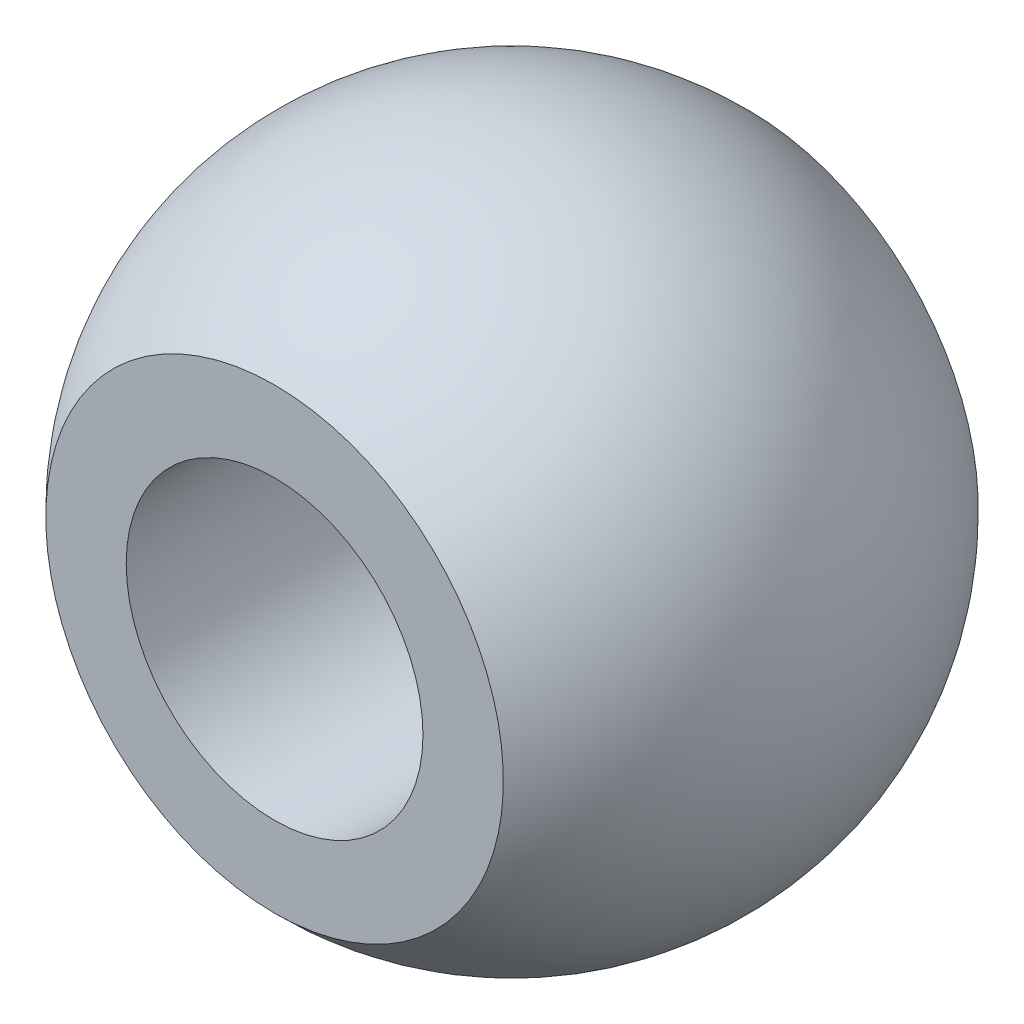
ISO-10303-21;
HEADER;
FILE_DESCRIPTION(('STEP AP214'),'2;1');
FILE_NAME('part.step','',(''),(''),'','','');
FILE_SCHEMA(('AUTOMOTIVE_DESIGN { 1 0 10303 214 1 1 1 1 }'));
ENDSEC;
DATA;
#1=APPLICATION_CONTEXT('core data for automotive mechanical design processes');
#2=APPLICATION_PROTOCOL_DEFINITION('international standard','automotive_design',2000,#1);
#3=PRODUCT_CONTEXT('',#1,'mechanical');
#4=PRODUCT('Part','Part','',(#3));
#5=PRODUCT_RELATED_PRODUCT_CATEGORY('part','',(#4));
#6=PRODUCT_DEFINITION_FORMATION('','',#4);
#7=PRODUCT_DEFINITION_CONTEXT('part definition',#1,'design');
#8=PRODUCT_DEFINITION('design','',#6,#7);
#9=PRODUCT_DEFINITION_SHAPE('','',#8);
#10=(LENGTH_UNIT() NAMED_UNIT(*) SI_UNIT(.MILLI.,.METRE.));
#11=(NAMED_UNIT(*) PLANE_ANGLE_UNIT() SI_UNIT($,.RADIAN.));
#12=(NAMED_UNIT(*) SI_UNIT($,.STERADIAN.) SOLID_ANGLE_UNIT());
#13=UNCERTAINTY_MEASURE_WITH_UNIT(LENGTH_MEASURE(1.E-05),#10,'distance_accuracy_value','');
#14=(GEOMETRIC_REPRESENTATION_CONTEXT(3) GLOBAL_UNCERTAINTY_ASSIGNED_CONTEXT((#13)) GLOBAL_UNIT_ASSIGNED_CONTEXT((#10,
#11,#12)) REPRESENTATION_CONTEXT('',''));
#15=CARTESIAN_POINT('',(0.,0.,0.));
#16=DIRECTION('',(0.,0.,1.));
#17=DIRECTION('',(1.,0.,0.));
#18=AXIS2_PLACEMENT_3D('',#15,#16,#17);
#19=CARTESIAN_POINT('',(0.,0.,0.));
#20=DIRECTION('',(0.,0.,1.));
#21=DIRECTION('',(0.,1.,0.));
#22=AXIS2_PLACEMENT_3D('',#19,#20,#21);
#23=SPHERICAL_SURFACE('',#22,5.555);
#24=CARTESIAN_POINT('',(0.,0.,4.));
#25=DIRECTION('',(0.,0.,1.));
#26=DIRECTION('',(1.,0.,0.));
#27=AXIS2_PLACEMENT_3D('',#24,#25,#26);
#28=CIRCLE('',#27,3.85461087530246);
#29=CARTESIAN_POINT('',(0.,3.85461087530246,4.));
#30=VERTEX_POINT('',#29);
#31=EDGE_CURVE('E10',#30,#30,#28,.T.);
#32=CARTESIAN_POINT('',(0.,0.,-4.));
#33=DIRECTION('',(0.,0.,1.));
#34=DIRECTION('',(1.,0.,0.));
#35=AXIS2_PLACEMENT_3D('',#32,#33,#34);
#36=CIRCLE('',#35,3.85461087530246);
#37=CARTESIAN_POINT('',(0.,3.85461087530246,-4.));
#38=VERTEX_POINT('',#37);
#39=EDGE_CURVE('E45',#38,#38,#36,.T.);
#40=CARTESIAN_POINT('',(0.,3.85461087530246,4.));
#41=CARTESIAN_POINT('',(0.,3.92160459176784,3.93544426188838));
#42=CARTESIAN_POINT('',(0.,3.98697348093006,3.86920267648272));
#43=CARTESIAN_POINT('',(0.,4.11430340097006,3.73352136709474));
#44=CARTESIAN_POINT('',(0.,4.17626443184785,3.66408164311243));
#45=CARTESIAN_POINT('',(0.,4.29662043164093,3.52217761258262));
#46=CARTESIAN_POINT('',(0.,4.35501540055622,3.44971330603513));
#47=CARTESIAN_POINT('',(0.,4.46809237797238,3.30194346311925));
#48=CARTESIAN_POINT('',(0.,4.52277438647326,3.22663792675087));
#49=CARTESIAN_POINT('',(0.,4.62828729836303,3.07337556849825));
#50=CARTESIAN_POINT('',(0.,4.67911820175192,2.99541874661401));
#51=CARTESIAN_POINT('',(0.,4.7768006441541,2.83705060861105));
#52=CARTESIAN_POINT('',(0.,4.82365218316738,2.75663929249234));
#53=CARTESIAN_POINT('',(0.,4.91325763690058,2.59356511069302));
#54=CARTESIAN_POINT('',(0.,4.95601155162049,2.51090224501242));
#55=CARTESIAN_POINT('',(0.,5.03731385089374,2.34353360269057));
#56=CARTESIAN_POINT('',(0.,5.07586223544707,2.25882782604932));
#57=CARTESIAN_POINT('',(0.,5.14865617984322,2.08758715360801));
#58=CARTESIAN_POINT('',(0.,5.18290173968603,2.00105225780794));
#59=CARTESIAN_POINT('',(0.,5.24700360104838,1.82637175624118));
#60=CARTESIAN_POINT('',(0.,5.27685990256793,1.7382261504745));
#61=CARTESIAN_POINT('',(0.,5.33210789167415,1.56054670329012));
#62=CARTESIAN_POINT('',(0.,5.35749957926082,1.47101286187244));
#63=CARTESIAN_POINT('',(0.,5.40375425337772,1.29078292158485));
#64=CARTESIAN_POINT('',(0.,5.42461723990795,1.20008682271495));
#65=CARTESIAN_POINT('',(0.,5.46176185494897,1.01776127917625));
#66=CARTESIAN_POINT('',(0.,5.47804348345976,0.926131834507459));
#67=CARTESIAN_POINT('',(0.,5.50598428858337,0.742170866738706));
#68=CARTESIAN_POINT('',(0.,5.5176434651962,0.649839343638747));
#69=CARTESIAN_POINT('',(0.,5.5363099394428,0.464707258379246));
#70=CARTESIAN_POINT('',(0.,5.54331723707658,0.371906696219705));
#71=CARTESIAN_POINT('',(0.,5.55266226735518,0.186070756040109));
#72=CARTESIAN_POINT('',(0.,5.555,0.0930353780200541));
#73=CARTESIAN_POINT('',(0.,5.555,-0.0930353780200553));
#74=CARTESIAN_POINT('',(0.,5.55266226735518,-0.18607075604011));
#75=CARTESIAN_POINT('',(0.,5.54331723707658,-0.371906696219706));
#76=CARTESIAN_POINT('',(0.,5.5363099394428,-0.464707258379248));
#77=CARTESIAN_POINT('',(0.,5.5176434651962,-0.649839343638748));
#78=CARTESIAN_POINT('',(0.,5.50598428858337,-0.742170866738707));
#79=CARTESIAN_POINT('',(0.,5.47804348345976,-0.92613183450746));
#80=CARTESIAN_POINT('',(0.,5.46176185494897,-1.01776127917626));
#81=CARTESIAN_POINT('',(0.,5.42461723990795,-1.20008682271495));
#82=CARTESIAN_POINT('',(0.,5.40375425337772,-1.29078292158485));
#83=CARTESIAN_POINT('',(0.,5.35749957926082,-1.47101286187244));
#84=CARTESIAN_POINT('',(0.,5.33210789167415,-1.56054670329012));
#85=CARTESIAN_POINT('',(0.,5.27685990256793,-1.7382261504745));
#86=CARTESIAN_POINT('',(0.,5.24700360104838,-1.82637175624118));
#87=CARTESIAN_POINT('',(0.,5.18290173968603,-2.00105225780794));
#88=CARTESIAN_POINT('',(0.,5.14865617984322,-2.08758715360801));
#89=CARTESIAN_POINT('',(0.,5.07586223544707,-2.25882782604933));
#90=CARTESIAN_POINT('',(0.,5.03731385089374,-2.34353360269057));
#91=CARTESIAN_POINT('',(0.,4.95601155162049,-2.51090224501242));
#92=CARTESIAN_POINT('',(0.,4.91325763690058,-2.59356511069302));
#93=CARTESIAN_POINT('',(0.,4.82365218316738,-2.75663929249234));
#94=CARTESIAN_POINT('',(0.,4.7768006441541,-2.83705060861105));
#95=CARTESIAN_POINT('',(0.,4.67911820175192,-2.99541874661401));
#96=CARTESIAN_POINT('',(0.,4.62828729836303,-3.07337556849825));
#97=CARTESIAN_POINT('',(0.,4.52277438647326,-3.22663792675087));
#98=CARTESIAN_POINT('',(0.,4.46809237797238,-3.30194346311925));
#99=CARTESIAN_POINT('',(0.,4.35501540055621,-3.44971330603513));
#100=CARTESIAN_POINT('',(0.,4.29662043164092,-3.52217761258262));
#101=CARTESIAN_POINT('',(0.,4.17626443184785,-3.66408164311243));
#102=CARTESIAN_POINT('',(0.,4.11430340097006,-3.73352136709474));
#103=CARTESIAN_POINT('',(0.,3.98697348093005,-3.86920267648272));
#104=CARTESIAN_POINT('',(0.,3.92160459176784,-3.93544426188838));
#105=CARTESIAN_POINT('',(0.,3.85461087530246,-4.));
#106=B_SPLINE_CURVE_WITH_KNOTS('',3,(#40,#41,#42,#43,#44,#45,#46,#47,#48,#49,#50,#51,#52,#53,
#54,#55,#56,#57,#58,#59,#60,#61,#62,#63,#64,#65,#66,#67,#68,#69,#70,#71,#72,#73,#74,#75,#76,#77,
#78,#79,#80,#81,#82,#83,#84,#85,#86,#87,#88,#89,#90,#91,#92,#93,#94,#95,#96,#97,#98,#99,#100,
#101,#102,#103,#104,#105),.UNSPECIFIED.,.F.,.F.,(4,2,2,2,2,2,2,2,2,2,2,2,2,2,2,2,2,2,2,2,2,2,2,
2,2,2,2,2,2,2,2,2,4),(0.,0.279076786712158,0.558153573424316,0.837230360136474,1.11630714684863,
1.39538393356079,1.67446072027295,1.95353750698511,2.23261429369726,2.51169108040942,
2.79076786712158,3.06984465383374,3.3489214405459,3.62799822725806,3.90707501397021,
4.18615180068237,4.46522858739453,4.74430537410669,5.02338216081885,5.302458947531,
5.58153573424316,5.86061252095532,6.13968930766748,6.41876609437964,6.69784288109179,
6.97691966780395,7.25599645451611,7.53507324122827,7.81415002794043,8.09322681465258,
8.37230360136474,8.6513803880769,8.93045717478906),.UNSPECIFIED.);
#107=EDGE_CURVE('BSEAM31',#30,#38,#106,.T.);
#108=ORIENTED_EDGE('',*,*,#31,.F.);
#109=ORIENTED_EDGE('',*,*,#39,.T.);
#110=ORIENTED_EDGE('',*,*,#107,.T.);
#111=ORIENTED_EDGE('',*,*,#107,.F.);
#112=EDGE_LOOP('',(#108,#110,#109,#111));
#113=FACE_BOUND('',#112,.T.);
#114=ADVANCED_FACE('F31',(#113),#23,.T.);
#115=CARTESIAN_POINT('',(0.,3.85461087530246,4.));
#116=DIRECTION('',(0.,0.,-1.));
#117=DIRECTION('',(-1.,0.,0.));
#118=AXIS2_PLACEMENT_3D('',#115,#116,#117);
#119=PLANE('',#118);
#120=CARTESIAN_POINT('',(0.,0.,4.));
#121=DIRECTION('',(0.,0.,1.));
#122=DIRECTION('',(1.,0.,0.));
#123=AXIS2_PLACEMENT_3D('',#120,#121,#122);
#124=CIRCLE('',#123,2.5);
#125=CARTESIAN_POINT('',(2.5,0.,4.));
#126=VERTEX_POINT('',#125);
#127=EDGE_CURVE('E37',#126,#126,#124,.T.);
#128=ORIENTED_EDGE('',*,*,#127,.F.);
#129=EDGE_LOOP('',(#128));
#130=FACE_BOUND('',#129,.T.);
#131=ORIENTED_EDGE('',*,*,#31,.T.);
#132=EDGE_LOOP('',(#131));
#133=FACE_BOUND('',#132,.T.);
#134=ADVANCED_FACE('F60',(#130,#133),#119,.F.);
#135=CARTESIAN_POINT('',(0.,0.,4.));
#136=DIRECTION('',(0.,0.,1.));
#137=DIRECTION('',(1.,0.,0.));
#138=AXIS2_PLACEMENT_3D('',#135,#136,#137);
#139=CYLINDRICAL_SURFACE('',#138,2.5);
#140=CARTESIAN_POINT('',(0.,0.,-4.));
#141=DIRECTION('',(0.,0.,1.));
#142=DIRECTION('',(1.,0.,0.));
#143=AXIS2_PLACEMENT_3D('',#140,#141,#142);
#144=CIRCLE('',#143,2.5);
#145=CARTESIAN_POINT('',(2.5,0.,-4.));
#146=VERTEX_POINT('',#145);
#147=EDGE_CURVE('E41',#146,#146,#144,.T.);
#148=ORIENTED_EDGE('',*,*,#147,.F.);
#149=EDGE_LOOP('',(#148));
#150=FACE_BOUND('',#149,.T.);
#151=ORIENTED_EDGE('',*,*,#127,.T.);
#152=EDGE_LOOP('',(#151));
#153=FACE_BOUND('',#152,.T.);
#154=ADVANCED_FACE('F55',(#150,#153),#139,.F.);
#155=CARTESIAN_POINT('',(0.,3.85461087530246,-4.));
#156=DIRECTION('',(0.,0.,1.));
#157=DIRECTION('',(1.,0.,0.));
#158=AXIS2_PLACEMENT_3D('',#155,#156,#157);
#159=PLANE('',#158);
#160=ORIENTED_EDGE('',*,*,#39,.F.);
#161=EDGE_LOOP('',(#160));
#162=FACE_BOUND('',#161,.T.);
#163=ORIENTED_EDGE('',*,*,#147,.T.);
#164=EDGE_LOOP('',(#163));
#165=FACE_BOUND('',#164,.T.);
#166=ADVANCED_FACE('F52',(#162,#165),#159,.F.);
#167=CLOSED_SHELL('',(#114,#134,#154,#166));
#168=MANIFOLD_SOLID_BREP('B2',#167);
#169=ADVANCED_BREP_SHAPE_REPRESENTATION('',(#18,#168),#14);
#170=SHAPE_DEFINITION_REPRESENTATION(#9,#169);
ENDSEC;
END-ISO-10303-21;
